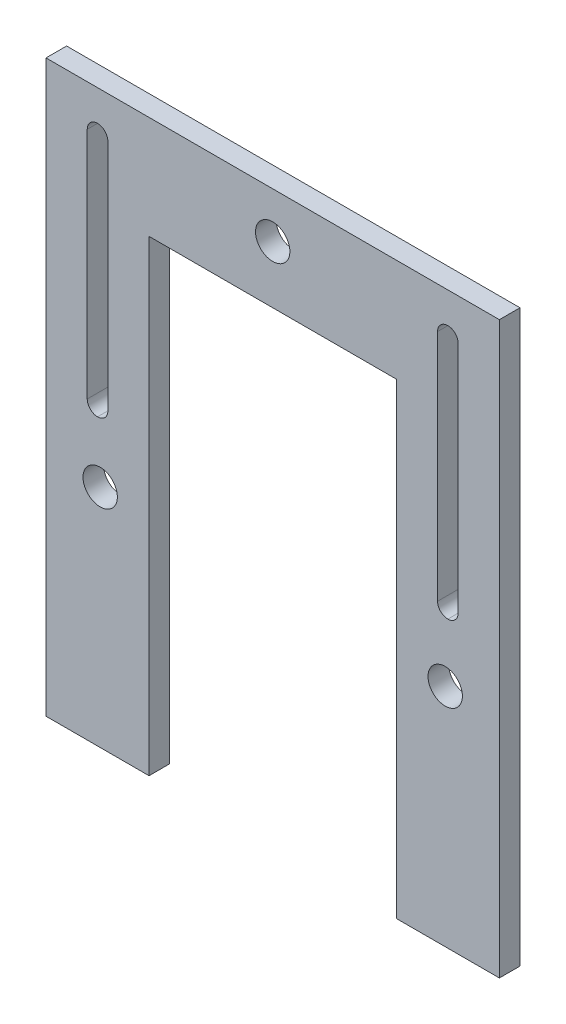
ISO-10303-21;
HEADER;
FILE_DESCRIPTION(('STEP AP214'),'2;1');
FILE_NAME('part.step','',(''),(''),'','','');
FILE_SCHEMA(('AUTOMOTIVE_DESIGN { 1 0 10303 214 1 1 1 1 }'));
ENDSEC;
DATA;
#1=APPLICATION_CONTEXT('core data for automotive mechanical design processes');
#2=APPLICATION_PROTOCOL_DEFINITION('international standard','automotive_design',2000,#1);
#3=PRODUCT_CONTEXT('',#1,'mechanical');
#4=PRODUCT('Part','Part','',(#3));
#5=PRODUCT_RELATED_PRODUCT_CATEGORY('part','',(#4));
#6=PRODUCT_DEFINITION_FORMATION('','',#4);
#7=PRODUCT_DEFINITION_CONTEXT('part definition',#1,'design');
#8=PRODUCT_DEFINITION('design','',#6,#7);
#9=PRODUCT_DEFINITION_SHAPE('','',#8);
#10=(LENGTH_UNIT() NAMED_UNIT(*) SI_UNIT(.MILLI.,.METRE.));
#11=(NAMED_UNIT(*) PLANE_ANGLE_UNIT() SI_UNIT($,.RADIAN.));
#12=(NAMED_UNIT(*) SI_UNIT($,.STERADIAN.) SOLID_ANGLE_UNIT());
#13=UNCERTAINTY_MEASURE_WITH_UNIT(LENGTH_MEASURE(1.E-05),#10,'distance_accuracy_value','');
#14=(GEOMETRIC_REPRESENTATION_CONTEXT(3) GLOBAL_UNCERTAINTY_ASSIGNED_CONTEXT((#13)) GLOBAL_UNIT_ASSIGNED_CONTEXT((#10,
#11,#12)) REPRESENTATION_CONTEXT('',''));
#15=CARTESIAN_POINT('',(0.,0.,0.));
#16=DIRECTION('',(0.,0.,1.));
#17=DIRECTION('',(1.,0.,0.));
#18=AXIS2_PLACEMENT_3D('',#15,#16,#17);
#19=CARTESIAN_POINT('',(0.,0.,3.));
#20=DIRECTION('',(0.,0.,1.));
#21=DIRECTION('',(1.,0.,0.));
#22=AXIS2_PLACEMENT_3D('',#19,#20,#21);
#23=PLANE('',#22);
#24=DIRECTION('',(0.,1.,0.));
#25=VECTOR('',#24,1.);
#26=CARTESIAN_POINT('',(27.,30.1934733920807,3.));
#27=LINE('',#26,#25);
#28=CARTESIAN_POINT('',(27.,-5.30652660791932,3.));
#29=VERTEX_POINT('',#28);
#30=CARTESIAN_POINT('',(27.,28.6934733920807,3.));
#31=VERTEX_POINT('',#30);
#32=EDGE_CURVE('E254',#29,#31,#27,.T.);
#33=ORIENTED_EDGE('',*,*,#32,.F.);
#34=CARTESIAN_POINT('',(25.5,-5.30652660791932,3.));
#35=DIRECTION('',(0.,0.,1.));
#36=DIRECTION('',(1.,0.,0.));
#37=AXIS2_PLACEMENT_3D('',#34,#35,#36);
#38=CIRCLE('',#37,1.5);
#39=CARTESIAN_POINT('',(25.5,-6.80652660791932,3.));
#40=VERTEX_POINT('',#39);
#41=EDGE_CURVE('E235',#29,#40,#38,.F.);
#42=ORIENTED_EDGE('',*,*,#41,.T.);
#43=CARTESIAN_POINT('',(25.5,-5.30652660791932,3.));
#44=DIRECTION('',(0.,0.,1.));
#45=DIRECTION('',(1.,0.,0.));
#46=AXIS2_PLACEMENT_3D('',#43,#44,#45);
#47=CIRCLE('',#46,1.5);
#48=CARTESIAN_POINT('',(24.,-5.30652660791932,3.));
#49=VERTEX_POINT('',#48);
#50=EDGE_CURVE('E231',#40,#49,#47,.F.);
#51=ORIENTED_EDGE('',*,*,#50,.T.);
#52=DIRECTION('',(0.,-1.,0.));
#53=VECTOR('',#52,1.);
#54=CARTESIAN_POINT('',(24.,30.1934733920807,3.));
#55=LINE('',#54,#53);
#56=CARTESIAN_POINT('',(24.,28.6934733920807,3.));
#57=VERTEX_POINT('',#56);
#58=EDGE_CURVE('E618',#57,#49,#55,.T.);
#59=ORIENTED_EDGE('',*,*,#58,.F.);
#60=CARTESIAN_POINT('',(25.5,28.6934733920807,3.));
#61=DIRECTION('',(0.,0.,1.));
#62=DIRECTION('',(1.,0.,0.));
#63=AXIS2_PLACEMENT_3D('',#60,#61,#62);
#64=CIRCLE('',#63,1.5);
#65=CARTESIAN_POINT('',(25.5,30.1934733920807,3.));
#66=VERTEX_POINT('',#65);
#67=EDGE_CURVE('E227',#57,#66,#64,.F.);
#68=ORIENTED_EDGE('',*,*,#67,.T.);
#69=CARTESIAN_POINT('',(25.5,28.6934733920807,3.));
#70=DIRECTION('',(0.,0.,1.));
#71=DIRECTION('',(1.,0.,0.));
#72=AXIS2_PLACEMENT_3D('',#69,#70,#71);
#73=CIRCLE('',#72,1.5);
#74=EDGE_CURVE('E223',#66,#31,#73,.F.);
#75=ORIENTED_EDGE('',*,*,#74,.T.);
#76=EDGE_LOOP('',(#33,#42,#51,#59,#68,#75));
#77=FACE_BOUND('',#76,.T.);
#78=CARTESIAN_POINT('',(-25.5,-5.30652660791935,3.));
#79=DIRECTION('',(0.,0.,1.));
#80=DIRECTION('',(1.,0.,0.));
#81=AXIS2_PLACEMENT_3D('',#78,#79,#80);
#82=CIRCLE('',#81,1.5);
#83=CARTESIAN_POINT('',(-24.,-5.30652660791935,3.));
#84=VERTEX_POINT('',#83);
#85=CARTESIAN_POINT('',(-25.5,-6.80652660791935,3.));
#86=VERTEX_POINT('',#85);
#87=EDGE_CURVE('E239',#84,#86,#82,.F.);
#88=ORIENTED_EDGE('',*,*,#87,.T.);
#89=CARTESIAN_POINT('',(-25.5,-5.30652660791935,3.));
#90=DIRECTION('',(0.,0.,1.));
#91=DIRECTION('',(1.,0.,0.));
#92=AXIS2_PLACEMENT_3D('',#89,#90,#91);
#93=CIRCLE('',#92,1.5);
#94=CARTESIAN_POINT('',(-27.,-5.30652660791935,3.));
#95=VERTEX_POINT('',#94);
#96=EDGE_CURVE('E243',#86,#95,#93,.F.);
#97=ORIENTED_EDGE('',*,*,#96,.T.);
#98=DIRECTION('',(0.,-1.,0.));
#99=VECTOR('',#98,1.);
#100=CARTESIAN_POINT('',(-27.,30.1934733920807,3.));
#101=LINE('',#100,#99);
#102=CARTESIAN_POINT('',(-27.,28.6934733920807,3.));
#103=VERTEX_POINT('',#102);
#104=EDGE_CURVE('E285',#103,#95,#101,.T.);
#105=ORIENTED_EDGE('',*,*,#104,.F.);
#106=CARTESIAN_POINT('',(-25.5,28.6934733920807,3.));
#107=DIRECTION('',(0.,0.,1.));
#108=DIRECTION('',(1.,0.,0.));
#109=AXIS2_PLACEMENT_3D('',#106,#107,#108);
#110=CIRCLE('',#109,1.5);
#111=CARTESIAN_POINT('',(-25.5,30.1934733920807,3.));
#112=VERTEX_POINT('',#111);
#113=EDGE_CURVE('E44',#103,#112,#110,.F.);
#114=ORIENTED_EDGE('',*,*,#113,.T.);
#115=CARTESIAN_POINT('',(-25.5,28.6934733920807,3.));
#116=DIRECTION('',(0.,0.,1.));
#117=DIRECTION('',(1.,0.,0.));
#118=AXIS2_PLACEMENT_3D('',#115,#116,#117);
#119=CIRCLE('',#118,1.5);
#120=CARTESIAN_POINT('',(-24.,28.6934733920807,3.));
#121=VERTEX_POINT('',#120);
#122=EDGE_CURVE('E247',#112,#121,#119,.F.);
#123=ORIENTED_EDGE('',*,*,#122,.T.);
#124=DIRECTION('',(0.,1.,0.));
#125=VECTOR('',#124,1.);
#126=CARTESIAN_POINT('',(-24.,30.1934733920807,3.));
#127=LINE('',#126,#125);
#128=EDGE_CURVE('E289',#84,#121,#127,.T.);
#129=ORIENTED_EDGE('',*,*,#128,.F.);
#130=EDGE_LOOP('',(#88,#97,#105,#114,#123,#129));
#131=FACE_BOUND('',#130,.T.);
#132=CARTESIAN_POINT('',(25.1147367097487,-15.4696223841785,3.));
#133=DIRECTION('',(0.,0.,1.));
#134=DIRECTION('',(1.,0.,0.));
#135=AXIS2_PLACEMENT_3D('',#132,#133,#134);
#136=CIRCLE('',#135,2.5);
#137=CARTESIAN_POINT('',(27.6147367097487,-15.4696223841785,3.));
#138=VERTEX_POINT('',#137);
#139=EDGE_CURVE('E297',#138,#138,#136,.T.);
#140=ORIENTED_EDGE('',*,*,#139,.F.);
#141=EDGE_LOOP('',(#140));
#142=FACE_BOUND('',#141,.T.);
#143=DIRECTION('',(0.,-1.,0.));
#144=VECTOR('',#143,1.);
#145=CARTESIAN_POINT('',(18.,19.6934733920807,3.));
#146=LINE('',#145,#144);
#147=CARTESIAN_POINT('',(18.,19.6934733920807,3.));
#148=VERTEX_POINT('',#147);
#149=CARTESIAN_POINT('',(18.,-48.3065266079193,3.));
#150=VERTEX_POINT('',#149);
#151=EDGE_CURVE('E184',#148,#150,#146,.T.);
#152=ORIENTED_EDGE('',*,*,#151,.T.);
#153=DIRECTION('',(1.,0.,0.));
#154=VECTOR('',#153,1.);
#155=CARTESIAN_POINT('',(18.,-48.3065266079193,3.));
#156=LINE('',#155,#154);
#157=CARTESIAN_POINT('',(33.,-48.3065266079193,3.));
#158=VERTEX_POINT('',#157);
#159=EDGE_CURVE('E173',#150,#158,#156,.T.);
#160=ORIENTED_EDGE('',*,*,#159,.T.);
#161=DIRECTION('',(0.,1.,0.));
#162=VECTOR('',#161,1.);
#163=CARTESIAN_POINT('',(33.,-48.3065266079193,3.));
#164=LINE('',#163,#162);
#165=CARTESIAN_POINT('',(33.,34.6934733920807,3.));
#166=VERTEX_POINT('',#165);
#167=EDGE_CURVE('E183',#158,#166,#164,.T.);
#168=ORIENTED_EDGE('',*,*,#167,.T.);
#169=DIRECTION('',(-1.,0.,0.));
#170=VECTOR('',#169,1.);
#171=CARTESIAN_POINT('',(33.,34.6934733920807,3.));
#172=LINE('',#171,#170);
#173=CARTESIAN_POINT('',(-33.,34.6934733920807,3.));
#174=VERTEX_POINT('',#173);
#175=EDGE_CURVE('E309',#166,#174,#172,.T.);
#176=ORIENTED_EDGE('',*,*,#175,.T.);
#177=DIRECTION('',(0.,-1.,0.));
#178=VECTOR('',#177,1.);
#179=CARTESIAN_POINT('',(-33.,-48.3065266079193,3.));
#180=LINE('',#179,#178);
#181=CARTESIAN_POINT('',(-33.,-48.3065266079193,3.));
#182=VERTEX_POINT('',#181);
#183=EDGE_CURVE('E311',#174,#182,#180,.T.);
#184=ORIENTED_EDGE('',*,*,#183,.T.);
#185=DIRECTION('',(1.,0.,0.));
#186=VECTOR('',#185,1.);
#187=CARTESIAN_POINT('',(-18.,-48.3065266079194,3.));
#188=LINE('',#187,#186);
#189=CARTESIAN_POINT('',(-18.,-48.3065266079194,3.));
#190=VERTEX_POINT('',#189);
#191=EDGE_CURVE('E313',#182,#190,#188,.T.);
#192=ORIENTED_EDGE('',*,*,#191,.T.);
#193=DIRECTION('',(0.,1.,0.));
#194=VECTOR('',#193,1.);
#195=CARTESIAN_POINT('',(-18.,19.6934733920807,3.));
#196=LINE('',#195,#194);
#197=CARTESIAN_POINT('',(-18.,19.6934733920807,3.));
#198=VERTEX_POINT('',#197);
#199=EDGE_CURVE('E315',#190,#198,#196,.T.);
#200=ORIENTED_EDGE('',*,*,#199,.T.);
#201=DIRECTION('',(1.,0.,0.));
#202=VECTOR('',#201,1.);
#203=CARTESIAN_POINT('',(-18.,19.6934733920807,3.));
#204=LINE('',#203,#202);
#205=EDGE_CURVE('E189',#198,#148,#204,.T.);
#206=ORIENTED_EDGE('',*,*,#205,.T.);
#207=EDGE_LOOP('',(#152,#160,#168,#176,#184,#192,#200,#206));
#208=FACE_BOUND('',#207,.T.);
#209=CARTESIAN_POINT('',(0.,28.0303776158215,3.));
#210=DIRECTION('',(0.,0.,1.));
#211=DIRECTION('',(1.,0.,0.));
#212=AXIS2_PLACEMENT_3D('',#209,#210,#211);
#213=CIRCLE('',#212,2.5);
#214=CARTESIAN_POINT('',(2.5,28.0303776158215,3.));
#215=VERTEX_POINT('',#214);
#216=EDGE_CURVE('E303',#215,#215,#213,.T.);
#217=ORIENTED_EDGE('',*,*,#216,.F.);
#218=EDGE_LOOP('',(#217));
#219=FACE_BOUND('',#218,.T.);
#220=CARTESIAN_POINT('',(-25.1147367097487,-15.4696223841785,3.));
#221=DIRECTION('',(0.,0.,1.));
#222=DIRECTION('',(1.,0.,0.));
#223=AXIS2_PLACEMENT_3D('',#220,#221,#222);
#224=CIRCLE('',#223,2.5);
#225=CARTESIAN_POINT('',(-22.6147367097487,-15.4696223841785,3.));
#226=VERTEX_POINT('',#225);
#227=EDGE_CURVE('E283',#226,#226,#224,.T.);
#228=ORIENTED_EDGE('',*,*,#227,.F.);
#229=EDGE_LOOP('',(#228));
#230=FACE_BOUND('',#229,.T.);
#231=ADVANCED_FACE('F35',(#77,#131,#142,#208,#219,#230),#23,.T.);
#232=CARTESIAN_POINT('',(0.,0.,0.));
#233=DIRECTION('',(0.,0.,1.));
#234=DIRECTION('',(1.,0.,0.));
#235=AXIS2_PLACEMENT_3D('',#232,#233,#234);
#236=PLANE('',#235);
#237=CARTESIAN_POINT('',(25.5,-5.30652660791932,0.));
#238=DIRECTION('',(0.,0.,1.));
#239=DIRECTION('',(1.,0.,0.));
#240=AXIS2_PLACEMENT_3D('',#237,#238,#239);
#241=CIRCLE('',#240,1.5);
#242=CARTESIAN_POINT('',(24.,-5.30652660791932,0.));
#243=VERTEX_POINT('',#242);
#244=CARTESIAN_POINT('',(25.5,-6.80652660791932,0.));
#245=VERTEX_POINT('',#244);
#246=EDGE_CURVE('E233',#243,#245,#241,.T.);
#247=ORIENTED_EDGE('',*,*,#246,.T.);
#248=CARTESIAN_POINT('',(25.5,-5.30652660791932,0.));
#249=DIRECTION('',(0.,0.,1.));
#250=DIRECTION('',(1.,0.,0.));
#251=AXIS2_PLACEMENT_3D('',#248,#249,#250);
#252=CIRCLE('',#251,1.5);
#253=CARTESIAN_POINT('',(27.,-5.30652660791932,0.));
#254=VERTEX_POINT('',#253);
#255=EDGE_CURVE('E237',#245,#254,#252,.T.);
#256=ORIENTED_EDGE('',*,*,#255,.T.);
#257=DIRECTION('',(0.,1.,0.));
#258=VECTOR('',#257,1.);
#259=CARTESIAN_POINT('',(27.,30.1934733920807,0.));
#260=LINE('',#259,#258);
#261=CARTESIAN_POINT('',(27.,28.6934733920807,0.));
#262=VERTEX_POINT('',#261);
#263=EDGE_CURVE('E620',#254,#262,#260,.T.);
#264=ORIENTED_EDGE('',*,*,#263,.T.);
#265=CARTESIAN_POINT('',(25.5,28.6934733920807,0.));
#266=DIRECTION('',(0.,0.,1.));
#267=DIRECTION('',(1.,0.,0.));
#268=AXIS2_PLACEMENT_3D('',#265,#266,#267);
#269=CIRCLE('',#268,1.5);
#270=CARTESIAN_POINT('',(25.5,30.1934733920807,0.));
#271=VERTEX_POINT('',#270);
#272=EDGE_CURVE('E225',#262,#271,#269,.T.);
#273=ORIENTED_EDGE('',*,*,#272,.T.);
#274=CARTESIAN_POINT('',(25.5,28.6934733920807,0.));
#275=DIRECTION('',(0.,0.,1.));
#276=DIRECTION('',(1.,0.,0.));
#277=AXIS2_PLACEMENT_3D('',#274,#275,#276);
#278=CIRCLE('',#277,1.5);
#279=CARTESIAN_POINT('',(24.,28.6934733920807,0.));
#280=VERTEX_POINT('',#279);
#281=EDGE_CURVE('E229',#271,#280,#278,.T.);
#282=ORIENTED_EDGE('',*,*,#281,.T.);
#283=DIRECTION('',(0.,-1.,0.));
#284=VECTOR('',#283,1.);
#285=CARTESIAN_POINT('',(24.,30.1934733920807,0.));
#286=LINE('',#285,#284);
#287=EDGE_CURVE('E292',#280,#243,#286,.T.);
#288=ORIENTED_EDGE('',*,*,#287,.T.);
#289=EDGE_LOOP('',(#247,#256,#264,#273,#282,#288));
#290=FACE_BOUND('',#289,.T.);
#291=DIRECTION('',(0.,-1.,0.));
#292=VECTOR('',#291,1.);
#293=CARTESIAN_POINT('',(-27.,30.1934733920807,0.));
#294=LINE('',#293,#292);
#295=CARTESIAN_POINT('',(-27.,28.6934733920807,0.));
#296=VERTEX_POINT('',#295);
#297=CARTESIAN_POINT('',(-27.,-5.30652660791935,0.));
#298=VERTEX_POINT('',#297);
#299=EDGE_CURVE('E273',#296,#298,#294,.T.);
#300=ORIENTED_EDGE('',*,*,#299,.T.);
#301=CARTESIAN_POINT('',(-25.5,-5.30652660791935,0.));
#302=DIRECTION('',(0.,0.,1.));
#303=DIRECTION('',(1.,0.,0.));
#304=AXIS2_PLACEMENT_3D('',#301,#302,#303);
#305=CIRCLE('',#304,1.5);
#306=CARTESIAN_POINT('',(-25.5,-6.80652660791935,0.));
#307=VERTEX_POINT('',#306);
#308=EDGE_CURVE('E245',#298,#307,#305,.T.);
#309=ORIENTED_EDGE('',*,*,#308,.T.);
#310=CARTESIAN_POINT('',(-25.5,-5.30652660791935,0.));
#311=DIRECTION('',(0.,0.,1.));
#312=DIRECTION('',(1.,0.,0.));
#313=AXIS2_PLACEMENT_3D('',#310,#311,#312);
#314=CIRCLE('',#313,1.5);
#315=CARTESIAN_POINT('',(-24.,-5.30652660791935,0.));
#316=VERTEX_POINT('',#315);
#317=EDGE_CURVE('E241',#307,#316,#314,.T.);
#318=ORIENTED_EDGE('',*,*,#317,.T.);
#319=DIRECTION('',(0.,1.,0.));
#320=VECTOR('',#319,1.);
#321=CARTESIAN_POINT('',(-24.,30.1934733920807,0.));
#322=LINE('',#321,#320);
#323=CARTESIAN_POINT('',(-24.,28.6934733920807,0.));
#324=VERTEX_POINT('',#323);
#325=EDGE_CURVE('E280',#316,#324,#322,.T.);
#326=ORIENTED_EDGE('',*,*,#325,.T.);
#327=CARTESIAN_POINT('',(-25.5,28.6934733920807,0.));
#328=DIRECTION('',(0.,0.,1.));
#329=DIRECTION('',(1.,0.,0.));
#330=AXIS2_PLACEMENT_3D('',#327,#328,#329);
#331=CIRCLE('',#330,1.5);
#332=CARTESIAN_POINT('',(-25.5,30.1934733920807,0.));
#333=VERTEX_POINT('',#332);
#334=EDGE_CURVE('E51',#324,#333,#331,.T.);
#335=ORIENTED_EDGE('',*,*,#334,.T.);
#336=CARTESIAN_POINT('',(-25.5,28.6934733920807,0.));
#337=DIRECTION('',(0.,0.,1.));
#338=DIRECTION('',(1.,0.,0.));
#339=AXIS2_PLACEMENT_3D('',#336,#337,#338);
#340=CIRCLE('',#339,1.5);
#341=EDGE_CURVE('E11',#333,#296,#340,.T.);
#342=ORIENTED_EDGE('',*,*,#341,.T.);
#343=EDGE_LOOP('',(#300,#309,#318,#326,#335,#342));
#344=FACE_BOUND('',#343,.T.);
#345=DIRECTION('',(0.,-1.,0.));
#346=VECTOR('',#345,1.);
#347=CARTESIAN_POINT('',(18.,19.6934733920807,0.));
#348=LINE('',#347,#346);
#349=CARTESIAN_POINT('',(18.,19.6934733920807,0.));
#350=VERTEX_POINT('',#349);
#351=CARTESIAN_POINT('',(18.,-48.3065266079193,0.));
#352=VERTEX_POINT('',#351);
#353=EDGE_CURVE('E197',#350,#352,#348,.T.);
#354=ORIENTED_EDGE('',*,*,#353,.F.);
#355=DIRECTION('',(1.,0.,0.));
#356=VECTOR('',#355,1.);
#357=CARTESIAN_POINT('',(-18.,19.6934733920807,0.));
#358=LINE('',#357,#356);
#359=CARTESIAN_POINT('',(-18.,19.6934733920807,0.));
#360=VERTEX_POINT('',#359);
#361=EDGE_CURVE('E193',#360,#350,#358,.T.);
#362=ORIENTED_EDGE('',*,*,#361,.F.);
#363=DIRECTION('',(0.,1.,0.));
#364=VECTOR('',#363,1.);
#365=CARTESIAN_POINT('',(-18.,19.6934733920807,0.));
#366=LINE('',#365,#364);
#367=CARTESIAN_POINT('',(-18.,-48.3065266079194,0.));
#368=VERTEX_POINT('',#367);
#369=EDGE_CURVE('E330',#368,#360,#366,.T.);
#370=ORIENTED_EDGE('',*,*,#369,.F.);
#371=DIRECTION('',(1.,0.,0.));
#372=VECTOR('',#371,1.);
#373=CARTESIAN_POINT('',(-18.,-48.3065266079194,0.));
#374=LINE('',#373,#372);
#375=CARTESIAN_POINT('',(-33.,-48.3065266079193,0.));
#376=VERTEX_POINT('',#375);
#377=EDGE_CURVE('E328',#376,#368,#374,.T.);
#378=ORIENTED_EDGE('',*,*,#377,.F.);
#379=DIRECTION('',(0.,-1.,0.));
#380=VECTOR('',#379,1.);
#381=CARTESIAN_POINT('',(-33.,-48.3065266079193,0.));
#382=LINE('',#381,#380);
#383=CARTESIAN_POINT('',(-33.,34.6934733920807,0.));
#384=VERTEX_POINT('',#383);
#385=EDGE_CURVE('E326',#384,#376,#382,.T.);
#386=ORIENTED_EDGE('',*,*,#385,.F.);
#387=DIRECTION('',(-1.,0.,0.));
#388=VECTOR('',#387,1.);
#389=CARTESIAN_POINT('',(33.,34.6934733920807,0.));
#390=LINE('',#389,#388);
#391=CARTESIAN_POINT('',(33.,34.6934733920807,0.));
#392=VERTEX_POINT('',#391);
#393=EDGE_CURVE('E324',#392,#384,#390,.T.);
#394=ORIENTED_EDGE('',*,*,#393,.F.);
#395=DIRECTION('',(0.,1.,0.));
#396=VECTOR('',#395,1.);
#397=CARTESIAN_POINT('',(33.,-48.3065266079193,0.));
#398=LINE('',#397,#396);
#399=CARTESIAN_POINT('',(33.,-48.3065266079193,0.));
#400=VERTEX_POINT('',#399);
#401=EDGE_CURVE('E322',#400,#392,#398,.T.);
#402=ORIENTED_EDGE('',*,*,#401,.F.);
#403=DIRECTION('',(1.,0.,0.));
#404=VECTOR('',#403,1.);
#405=CARTESIAN_POINT('',(18.,-48.3065266079193,0.));
#406=LINE('',#405,#404);
#407=EDGE_CURVE('E320',#352,#400,#406,.T.);
#408=ORIENTED_EDGE('',*,*,#407,.F.);
#409=EDGE_LOOP('',(#354,#362,#370,#378,#386,#394,#402,#408));
#410=FACE_BOUND('',#409,.T.);
#411=CARTESIAN_POINT('',(0.,28.0303776158215,0.));
#412=DIRECTION('',(0.,0.,1.));
#413=DIRECTION('',(1.,0.,0.));
#414=AXIS2_PLACEMENT_3D('',#411,#412,#413);
#415=CIRCLE('',#414,2.5);
#416=CARTESIAN_POINT('',(2.5,28.0303776158215,0.));
#417=VERTEX_POINT('',#416);
#418=EDGE_CURVE('E300',#417,#417,#415,.T.);
#419=ORIENTED_EDGE('',*,*,#418,.T.);
#420=EDGE_LOOP('',(#419));
#421=FACE_BOUND('',#420,.T.);
#422=CARTESIAN_POINT('',(25.1147367097487,-15.4696223841785,0.));
#423=DIRECTION('',(0.,0.,1.));
#424=DIRECTION('',(1.,0.,0.));
#425=AXIS2_PLACEMENT_3D('',#422,#423,#424);
#426=CIRCLE('',#425,2.5);
#427=CARTESIAN_POINT('',(27.6147367097487,-15.4696223841785,0.));
#428=VERTEX_POINT('',#427);
#429=EDGE_CURVE('E295',#428,#428,#426,.T.);
#430=ORIENTED_EDGE('',*,*,#429,.T.);
#431=EDGE_LOOP('',(#430));
#432=FACE_BOUND('',#431,.T.);
#433=CARTESIAN_POINT('',(-25.1147367097487,-15.4696223841785,0.));
#434=DIRECTION('',(0.,0.,1.));
#435=DIRECTION('',(1.,0.,0.));
#436=AXIS2_PLACEMENT_3D('',#433,#434,#435);
#437=CIRCLE('',#436,2.5);
#438=CARTESIAN_POINT('',(-22.6147367097487,-15.4696223841785,0.));
#439=VERTEX_POINT('',#438);
#440=EDGE_CURVE('E279',#439,#439,#437,.T.);
#441=ORIENTED_EDGE('',*,*,#440,.T.);
#442=EDGE_LOOP('',(#441));
#443=FACE_BOUND('',#442,.T.);
#444=ADVANCED_FACE('F271',(#290,#344,#410,#421,#432,#443),#236,.F.);
#445=CARTESIAN_POINT('',(18.,19.6934733920807,3.));
#446=DIRECTION('',(1.,0.,0.));
#447=DIRECTION('',(0.,0.,-1.));
#448=AXIS2_PLACEMENT_3D('',#445,#446,#447);
#449=PLANE('',#448);
#450=ORIENTED_EDGE('',*,*,#353,.T.);
#451=DIRECTION('',(0.,0.,-1.));
#452=VECTOR('',#451,1.);
#453=CARTESIAN_POINT('',(18.,-48.3065266079193,3.));
#454=LINE('',#453,#452);
#455=EDGE_CURVE('E177',#150,#352,#454,.T.);
#456=ORIENTED_EDGE('',*,*,#455,.F.);
#457=ORIENTED_EDGE('',*,*,#151,.F.);
#458=DIRECTION('',(0.,0.,-1.));
#459=VECTOR('',#458,1.);
#460=CARTESIAN_POINT('',(18.,19.6934733920807,3.));
#461=LINE('',#460,#459);
#462=EDGE_CURVE('E318',#148,#350,#461,.T.);
#463=ORIENTED_EDGE('',*,*,#462,.T.);
#464=EDGE_LOOP('',(#450,#456,#457,#463));
#465=FACE_BOUND('',#464,.T.);
#466=ADVANCED_FACE('F195',(#465),#449,.F.);
#467=CARTESIAN_POINT('',(18.,-48.3065266079193,3.));
#468=DIRECTION('',(0.,1.,0.));
#469=DIRECTION('',(-1.,0.,0.));
#470=AXIS2_PLACEMENT_3D('',#467,#468,#469);
#471=PLANE('',#470);
#472=ORIENTED_EDGE('',*,*,#407,.T.);
#473=DIRECTION('',(0.,0.,-1.));
#474=VECTOR('',#473,1.);
#475=CARTESIAN_POINT('',(33.,-48.3065266079193,3.));
#476=LINE('',#475,#474);
#477=EDGE_CURVE('E180',#158,#400,#476,.T.);
#478=ORIENTED_EDGE('',*,*,#477,.F.);
#479=ORIENTED_EDGE('',*,*,#159,.F.);
#480=ORIENTED_EDGE('',*,*,#455,.T.);
#481=EDGE_LOOP('',(#472,#478,#479,#480));
#482=FACE_BOUND('',#481,.T.);
#483=ADVANCED_FACE('F175',(#482),#471,.F.);
#484=CARTESIAN_POINT('',(33.,-48.3065266079193,3.));
#485=DIRECTION('',(-1.,0.,0.));
#486=DIRECTION('',(0.,-1.,0.));
#487=AXIS2_PLACEMENT_3D('',#484,#485,#486);
#488=PLANE('',#487);
#489=ORIENTED_EDGE('',*,*,#401,.T.);
#490=DIRECTION('',(0.,0.,-1.));
#491=VECTOR('',#490,1.);
#492=CARTESIAN_POINT('',(33.,34.6934733920807,3.));
#493=LINE('',#492,#491);
#494=EDGE_CURVE('E202',#166,#392,#493,.T.);
#495=ORIENTED_EDGE('',*,*,#494,.F.);
#496=ORIENTED_EDGE('',*,*,#167,.F.);
#497=ORIENTED_EDGE('',*,*,#477,.T.);
#498=EDGE_LOOP('',(#489,#495,#496,#497));
#499=FACE_BOUND('',#498,.T.);
#500=ADVANCED_FACE('F368',(#499),#488,.F.);
#501=CARTESIAN_POINT('',(33.,34.6934733920807,3.));
#502=DIRECTION('',(0.,-1.,0.));
#503=DIRECTION('',(0.,0.,-1.));
#504=AXIS2_PLACEMENT_3D('',#501,#502,#503);
#505=PLANE('',#504);
#506=ORIENTED_EDGE('',*,*,#393,.T.);
#507=DIRECTION('',(0.,0.,-1.));
#508=VECTOR('',#507,1.);
#509=CARTESIAN_POINT('',(-33.,34.6934733920807,3.));
#510=LINE('',#509,#508);
#511=EDGE_CURVE('E343',#174,#384,#510,.T.);
#512=ORIENTED_EDGE('',*,*,#511,.F.);
#513=ORIENTED_EDGE('',*,*,#175,.F.);
#514=ORIENTED_EDGE('',*,*,#494,.T.);
#515=EDGE_LOOP('',(#506,#512,#513,#514));
#516=FACE_BOUND('',#515,.T.);
#517=ADVANCED_FACE('F350',(#516),#505,.F.);
#518=CARTESIAN_POINT('',(-33.,-48.3065266079193,3.));
#519=DIRECTION('',(1.,0.,0.));
#520=DIRECTION('',(0.,1.,0.));
#521=AXIS2_PLACEMENT_3D('',#518,#519,#520);
#522=PLANE('',#521);
#523=ORIENTED_EDGE('',*,*,#385,.T.);
#524=DIRECTION('',(0.,0.,-1.));
#525=VECTOR('',#524,1.);
#526=CARTESIAN_POINT('',(-33.,-48.3065266079193,3.));
#527=LINE('',#526,#525);
#528=EDGE_CURVE('E340',#182,#376,#527,.T.);
#529=ORIENTED_EDGE('',*,*,#528,.F.);
#530=ORIENTED_EDGE('',*,*,#183,.F.);
#531=ORIENTED_EDGE('',*,*,#511,.T.);
#532=EDGE_LOOP('',(#523,#529,#530,#531));
#533=FACE_BOUND('',#532,.T.);
#534=ADVANCED_FACE('F360',(#533),#522,.F.);
#535=CARTESIAN_POINT('',(-18.,-48.3065266079194,3.));
#536=DIRECTION('',(0.,1.,0.));
#537=DIRECTION('',(-1.,0.,0.));
#538=AXIS2_PLACEMENT_3D('',#535,#536,#537);
#539=PLANE('',#538);
#540=ORIENTED_EDGE('',*,*,#377,.T.);
#541=DIRECTION('',(0.,0.,-1.));
#542=VECTOR('',#541,1.);
#543=CARTESIAN_POINT('',(-18.,-48.3065266079194,3.));
#544=LINE('',#543,#542);
#545=EDGE_CURVE('E337',#190,#368,#544,.T.);
#546=ORIENTED_EDGE('',*,*,#545,.F.);
#547=ORIENTED_EDGE('',*,*,#191,.F.);
#548=ORIENTED_EDGE('',*,*,#528,.T.);
#549=EDGE_LOOP('',(#540,#546,#547,#548));
#550=FACE_BOUND('',#549,.T.);
#551=ADVANCED_FACE('F364',(#550),#539,.F.);
#552=CARTESIAN_POINT('',(-18.,19.6934733920807,3.));
#553=DIRECTION('',(-1.,0.,0.));
#554=DIRECTION('',(0.,-1.,0.));
#555=AXIS2_PLACEMENT_3D('',#552,#553,#554);
#556=PLANE('',#555);
#557=ORIENTED_EDGE('',*,*,#369,.T.);
#558=DIRECTION('',(0.,0.,-1.));
#559=VECTOR('',#558,1.);
#560=CARTESIAN_POINT('',(-18.,19.6934733920807,3.));
#561=LINE('',#560,#559);
#562=EDGE_CURVE('E334',#198,#360,#561,.T.);
#563=ORIENTED_EDGE('',*,*,#562,.F.);
#564=ORIENTED_EDGE('',*,*,#199,.F.);
#565=ORIENTED_EDGE('',*,*,#545,.T.);
#566=EDGE_LOOP('',(#557,#563,#564,#565));
#567=FACE_BOUND('',#566,.T.);
#568=ADVANCED_FACE('F393',(#567),#556,.F.);
#569=CARTESIAN_POINT('',(-18.,19.6934733920807,3.));
#570=DIRECTION('',(0.,1.,0.));
#571=DIRECTION('',(-1.,0.,0.));
#572=AXIS2_PLACEMENT_3D('',#569,#570,#571);
#573=PLANE('',#572);
#574=ORIENTED_EDGE('',*,*,#361,.T.);
#575=ORIENTED_EDGE('',*,*,#462,.F.);
#576=ORIENTED_EDGE('',*,*,#205,.F.);
#577=ORIENTED_EDGE('',*,*,#562,.T.);
#578=EDGE_LOOP('',(#574,#575,#576,#577));
#579=FACE_BOUND('',#578,.T.);
#580=ADVANCED_FACE('F390',(#579),#573,.F.);
#581=CARTESIAN_POINT('',(0.,28.0303776158215,3.));
#582=DIRECTION('',(0.,0.,-1.));
#583=DIRECTION('',(-1.,0.,0.));
#584=AXIS2_PLACEMENT_3D('',#581,#582,#583);
#585=CYLINDRICAL_SURFACE('',#584,2.5);
#586=ORIENTED_EDGE('',*,*,#216,.T.);
#587=EDGE_LOOP('',(#586));
#588=FACE_BOUND('',#587,.T.);
#589=ORIENTED_EDGE('',*,*,#418,.F.);
#590=EDGE_LOOP('',(#589));
#591=FACE_BOUND('',#590,.T.);
#592=ADVANCED_FACE('F387',(#588,#591),#585,.F.);
#593=CARTESIAN_POINT('',(25.1147367097487,-15.4696223841785,3.));
#594=DIRECTION('',(0.,0.,-1.));
#595=DIRECTION('',(-1.,0.,0.));
#596=AXIS2_PLACEMENT_3D('',#593,#594,#595);
#597=CYLINDRICAL_SURFACE('',#596,2.5);
#598=ORIENTED_EDGE('',*,*,#139,.T.);
#599=EDGE_LOOP('',(#598));
#600=FACE_BOUND('',#599,.T.);
#601=ORIENTED_EDGE('',*,*,#429,.F.);
#602=EDGE_LOOP('',(#601));
#603=FACE_BOUND('',#602,.T.);
#604=ADVANCED_FACE('F423',(#600,#603),#597,.F.);
#605=CARTESIAN_POINT('',(-25.1147367097487,-15.4696223841785,3.));
#606=DIRECTION('',(0.,0.,-1.));
#607=DIRECTION('',(-1.,0.,0.));
#608=AXIS2_PLACEMENT_3D('',#605,#606,#607);
#609=CYLINDRICAL_SURFACE('',#608,2.5);
#610=ORIENTED_EDGE('',*,*,#227,.T.);
#611=EDGE_LOOP('',(#610));
#612=FACE_BOUND('',#611,.T.);
#613=ORIENTED_EDGE('',*,*,#440,.F.);
#614=EDGE_LOOP('',(#613));
#615=FACE_BOUND('',#614,.T.);
#616=ADVANCED_FACE('F430',(#612,#615),#609,.F.);
#617=CARTESIAN_POINT('',(-24.,30.1934733920807,0.));
#618=DIRECTION('',(1.,0.,0.));
#619=DIRECTION('',(0.,1.,0.));
#620=AXIS2_PLACEMENT_3D('',#617,#618,#619);
#621=PLANE('',#620);
#622=ORIENTED_EDGE('',*,*,#325,.F.);
#623=DIRECTION('',(0.,0.,1.));
#624=VECTOR('',#623,1.);
#625=CARTESIAN_POINT('',(-24.,-5.30652660791935,3.));
#626=LINE('',#625,#624);
#627=EDGE_CURVE('E216',#316,#84,#626,.T.);
#628=ORIENTED_EDGE('',*,*,#627,.T.);
#629=ORIENTED_EDGE('',*,*,#128,.T.);
#630=DIRECTION('',(0.,0.,1.));
#631=VECTOR('',#630,1.);
#632=CARTESIAN_POINT('',(-24.,28.6934733920807,0.));
#633=LINE('',#632,#631);
#634=EDGE_CURVE('E213',#121,#324,#633,.F.);
#635=ORIENTED_EDGE('',*,*,#634,.T.);
#636=EDGE_LOOP('',(#622,#628,#629,#635));
#637=FACE_BOUND('',#636,.T.);
#638=ADVANCED_FACE('F437',(#637),#621,.F.);
#639=CARTESIAN_POINT('',(-27.,30.1934733920807,0.));
#640=DIRECTION('',(-1.,0.,0.));
#641=DIRECTION('',(0.,-1.,0.));
#642=AXIS2_PLACEMENT_3D('',#639,#640,#641);
#643=PLANE('',#642);
#644=ORIENTED_EDGE('',*,*,#104,.T.);
#645=DIRECTION('',(0.,0.,1.));
#646=VECTOR('',#645,1.);
#647=CARTESIAN_POINT('',(-27.,-5.30652660791935,0.));
#648=LINE('',#647,#646);
#649=EDGE_CURVE('E221',#95,#298,#648,.F.);
#650=ORIENTED_EDGE('',*,*,#649,.T.);
#651=ORIENTED_EDGE('',*,*,#299,.F.);
#652=DIRECTION('',(0.,0.,1.));
#653=VECTOR('',#652,1.);
#654=CARTESIAN_POINT('',(-27.,28.6934733920807,3.));
#655=LINE('',#654,#653);
#656=EDGE_CURVE('E219',#296,#103,#655,.T.);
#657=ORIENTED_EDGE('',*,*,#656,.T.);
#658=EDGE_LOOP('',(#644,#650,#651,#657));
#659=FACE_BOUND('',#658,.T.);
#660=ADVANCED_FACE('F277',(#659),#643,.F.);
#661=CARTESIAN_POINT('',(27.,30.1934733920807,0.));
#662=DIRECTION('',(1.,0.,0.));
#663=DIRECTION('',(0.,1.,0.));
#664=AXIS2_PLACEMENT_3D('',#661,#662,#663);
#665=PLANE('',#664);
#666=ORIENTED_EDGE('',*,*,#32,.T.);
#667=DIRECTION('',(0.,0.,1.));
#668=VECTOR('',#667,1.);
#669=CARTESIAN_POINT('',(27.,28.6934733920807,0.));
#670=LINE('',#669,#668);
#671=EDGE_CURVE('E200',#31,#262,#670,.F.);
#672=ORIENTED_EDGE('',*,*,#671,.T.);
#673=ORIENTED_EDGE('',*,*,#263,.F.);
#674=DIRECTION('',(0.,0.,1.));
#675=VECTOR('',#674,1.);
#676=CARTESIAN_POINT('',(27.,-5.30652660791932,3.));
#677=LINE('',#676,#675);
#678=EDGE_CURVE('E198',#254,#29,#677,.T.);
#679=ORIENTED_EDGE('',*,*,#678,.T.);
#680=EDGE_LOOP('',(#666,#672,#673,#679));
#681=FACE_BOUND('',#680,.T.);
#682=ADVANCED_FACE('F453',(#681),#665,.F.);
#683=CARTESIAN_POINT('',(24.,30.1934733920807,0.));
#684=DIRECTION('',(-1.,0.,0.));
#685=DIRECTION('',(0.,-1.,0.));
#686=AXIS2_PLACEMENT_3D('',#683,#684,#685);
#687=PLANE('',#686);
#688=ORIENTED_EDGE('',*,*,#287,.F.);
#689=DIRECTION('',(0.,0.,1.));
#690=VECTOR('',#689,1.);
#691=CARTESIAN_POINT('',(24.,28.6934733920807,3.));
#692=LINE('',#691,#690);
#693=EDGE_CURVE('E211',#280,#57,#692,.T.);
#694=ORIENTED_EDGE('',*,*,#693,.T.);
#695=ORIENTED_EDGE('',*,*,#58,.T.);
#696=DIRECTION('',(0.,0.,1.));
#697=VECTOR('',#696,1.);
#698=CARTESIAN_POINT('',(24.,-5.30652660791932,0.));
#699=LINE('',#698,#697);
#700=EDGE_CURVE('E208',#49,#243,#699,.F.);
#701=ORIENTED_EDGE('',*,*,#700,.T.);
#702=EDGE_LOOP('',(#688,#694,#695,#701));
#703=FACE_BOUND('',#702,.T.);
#704=ADVANCED_FACE('F460',(#703),#687,.F.);
#705=CARTESIAN_POINT('',(25.5,28.6934733920807,0.));
#706=DIRECTION('',(0.,0.,-1.));
#707=DIRECTION('',(-1.,0.,0.));
#708=AXIS2_PLACEMENT_3D('',#705,#706,#707);
#709=CYLINDRICAL_SURFACE('',#708,1.5);
#710=ORIENTED_EDGE('',*,*,#693,.F.);
#711=ORIENTED_EDGE('',*,*,#281,.F.);
#712=DIRECTION('',(0.,0.,1.));
#713=VECTOR('',#712,1.);
#714=CARTESIAN_POINT('',(25.5,30.1934733920807,0.));
#715=LINE('',#714,#713);
#716=EDGE_CURVE('E251',#66,#271,#715,.F.);
#717=ORIENTED_EDGE('',*,*,#716,.F.);
#718=ORIENTED_EDGE('',*,*,#67,.F.);
#719=EDGE_LOOP('',(#710,#711,#717,#718));
#720=FACE_BOUND('',#719,.T.);
#721=ADVANCED_FACE('F468',(#720),#709,.F.);
#722=CARTESIAN_POINT('',(25.5,28.6934733920807,0.));
#723=DIRECTION('',(0.,0.,-1.));
#724=DIRECTION('',(-1.,0.,0.));
#725=AXIS2_PLACEMENT_3D('',#722,#723,#724);
#726=CYLINDRICAL_SURFACE('',#725,1.5);
#727=ORIENTED_EDGE('',*,*,#272,.F.);
#728=ORIENTED_EDGE('',*,*,#671,.F.);
#729=ORIENTED_EDGE('',*,*,#74,.F.);
#730=ORIENTED_EDGE('',*,*,#716,.T.);
#731=EDGE_LOOP('',(#727,#728,#729,#730));
#732=FACE_BOUND('',#731,.T.);
#733=ADVANCED_FACE('F476',(#732),#726,.F.);
#734=CARTESIAN_POINT('',(25.5,-5.30652660791932,0.));
#735=DIRECTION('',(0.,0.,-1.));
#736=DIRECTION('',(-1.,0.,0.));
#737=AXIS2_PLACEMENT_3D('',#734,#735,#736);
#738=CYLINDRICAL_SURFACE('',#737,1.5);
#739=ORIENTED_EDGE('',*,*,#678,.F.);
#740=ORIENTED_EDGE('',*,*,#255,.F.);
#741=DIRECTION('',(0.,0.,1.));
#742=VECTOR('',#741,1.);
#743=CARTESIAN_POINT('',(25.5,-6.80652660791932,0.));
#744=LINE('',#743,#742);
#745=EDGE_CURVE('E255',#40,#245,#744,.F.);
#746=ORIENTED_EDGE('',*,*,#745,.F.);
#747=ORIENTED_EDGE('',*,*,#41,.F.);
#748=EDGE_LOOP('',(#739,#740,#746,#747));
#749=FACE_BOUND('',#748,.T.);
#750=ADVANCED_FACE('F484',(#749),#738,.F.);
#751=CARTESIAN_POINT('',(25.5,-5.30652660791932,0.));
#752=DIRECTION('',(0.,0.,-1.));
#753=DIRECTION('',(-1.,0.,0.));
#754=AXIS2_PLACEMENT_3D('',#751,#752,#753);
#755=CYLINDRICAL_SURFACE('',#754,1.5);
#756=ORIENTED_EDGE('',*,*,#246,.F.);
#757=ORIENTED_EDGE('',*,*,#700,.F.);
#758=ORIENTED_EDGE('',*,*,#50,.F.);
#759=ORIENTED_EDGE('',*,*,#745,.T.);
#760=EDGE_LOOP('',(#756,#757,#758,#759));
#761=FACE_BOUND('',#760,.T.);
#762=ADVANCED_FACE('F492',(#761),#755,.F.);
#763=CARTESIAN_POINT('',(-25.5,-5.30652660791935,0.));
#764=DIRECTION('',(0.,0.,-1.));
#765=DIRECTION('',(-1.,0.,0.));
#766=AXIS2_PLACEMENT_3D('',#763,#764,#765);
#767=CYLINDRICAL_SURFACE('',#766,1.5);
#768=DIRECTION('',(0.,0.,1.));
#769=VECTOR('',#768,1.);
#770=CARTESIAN_POINT('',(-25.5,-6.80652660791935,3.));
#771=LINE('',#770,#769);
#772=EDGE_CURVE('E257',#307,#86,#771,.T.);
#773=ORIENTED_EDGE('',*,*,#772,.F.);
#774=ORIENTED_EDGE('',*,*,#308,.F.);
#775=ORIENTED_EDGE('',*,*,#649,.F.);
#776=ORIENTED_EDGE('',*,*,#96,.F.);
#777=EDGE_LOOP('',(#773,#774,#775,#776));
#778=FACE_BOUND('',#777,.T.);
#779=ADVANCED_FACE('F500',(#778),#767,.F.);
#780=CARTESIAN_POINT('',(-25.5,-5.30652660791935,0.));
#781=DIRECTION('',(0.,0.,-1.));
#782=DIRECTION('',(-1.,0.,0.));
#783=AXIS2_PLACEMENT_3D('',#780,#781,#782);
#784=CYLINDRICAL_SURFACE('',#783,1.5);
#785=ORIENTED_EDGE('',*,*,#317,.F.);
#786=ORIENTED_EDGE('',*,*,#772,.T.);
#787=ORIENTED_EDGE('',*,*,#87,.F.);
#788=ORIENTED_EDGE('',*,*,#627,.F.);
#789=EDGE_LOOP('',(#785,#786,#787,#788));
#790=FACE_BOUND('',#789,.T.);
#791=ADVANCED_FACE('F508',(#790),#784,.F.);
#792=CARTESIAN_POINT('',(-25.5,28.6934733920807,0.));
#793=DIRECTION('',(0.,0.,-1.));
#794=DIRECTION('',(-1.,0.,0.));
#795=AXIS2_PLACEMENT_3D('',#792,#793,#794);
#796=CYLINDRICAL_SURFACE('',#795,1.5);
#797=ORIENTED_EDGE('',*,*,#656,.F.);
#798=ORIENTED_EDGE('',*,*,#341,.F.);
#799=DIRECTION('',(0.,0.,1.));
#800=VECTOR('',#799,1.);
#801=CARTESIAN_POINT('',(-25.5,30.1934733920807,0.));
#802=LINE('',#801,#800);
#803=EDGE_CURVE('E39',#112,#333,#802,.F.);
#804=ORIENTED_EDGE('',*,*,#803,.F.);
#805=ORIENTED_EDGE('',*,*,#113,.F.);
#806=EDGE_LOOP('',(#797,#798,#804,#805));
#807=FACE_BOUND('',#806,.T.);
#808=ADVANCED_FACE('F37',(#807),#796,.F.);
#809=CARTESIAN_POINT('',(-25.5,28.6934733920807,0.));
#810=DIRECTION('',(0.,0.,-1.));
#811=DIRECTION('',(-1.,0.,0.));
#812=AXIS2_PLACEMENT_3D('',#809,#810,#811);
#813=CYLINDRICAL_SURFACE('',#812,1.5);
#814=ORIENTED_EDGE('',*,*,#334,.F.);
#815=ORIENTED_EDGE('',*,*,#634,.F.);
#816=ORIENTED_EDGE('',*,*,#122,.F.);
#817=ORIENTED_EDGE('',*,*,#803,.T.);
#818=EDGE_LOOP('',(#814,#815,#816,#817));
#819=FACE_BOUND('',#818,.T.);
#820=ADVANCED_FACE('F265',(#819),#813,.F.);
#821=CLOSED_SHELL('',(#231,#444,#466,#483,#500,#517,#534,#551,#568,#580,#592,#604,#616,#638,
#660,#682,#704,#721,#733,#750,#762,#779,#791,#808,#820));
#822=MANIFOLD_SOLID_BREP('B2',#821);
#823=ADVANCED_BREP_SHAPE_REPRESENTATION('',(#18,#822),#14);
#824=SHAPE_DEFINITION_REPRESENTATION(#9,#823);
ENDSEC;
END-ISO-10303-21;
